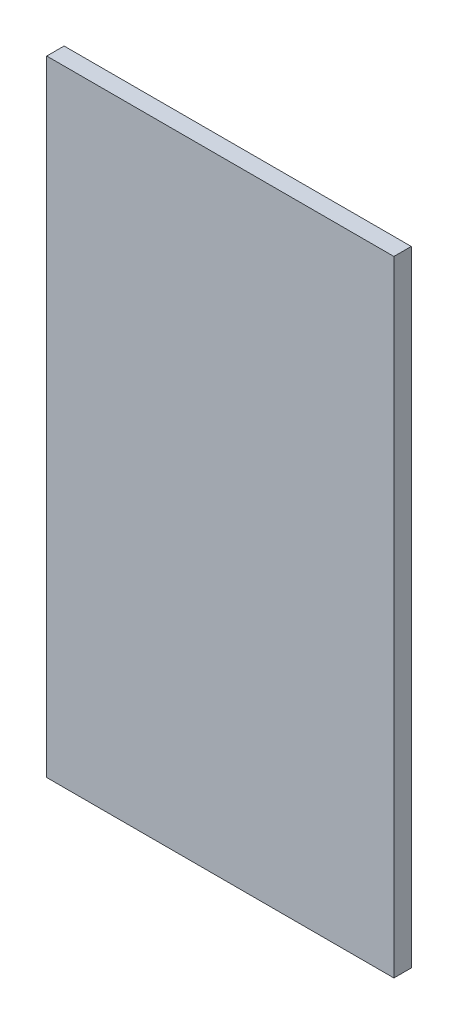
ISO-10303-21;
HEADER;
FILE_DESCRIPTION(('STEP AP214'),'2;1');
FILE_NAME('part.step','',(''),(''),'','','');
FILE_SCHEMA(('AUTOMOTIVE_DESIGN { 1 0 10303 214 1 1 1 1 }'));
ENDSEC;
DATA;
#1=APPLICATION_CONTEXT('core data for automotive mechanical design processes');
#2=APPLICATION_PROTOCOL_DEFINITION('international standard','automotive_design',2000,#1);
#3=PRODUCT_CONTEXT('',#1,'mechanical');
#4=PRODUCT('Part','Part','',(#3));
#5=PRODUCT_RELATED_PRODUCT_CATEGORY('part','',(#4));
#6=PRODUCT_DEFINITION_FORMATION('','',#4);
#7=PRODUCT_DEFINITION_CONTEXT('part definition',#1,'design');
#8=PRODUCT_DEFINITION('design','',#6,#7);
#9=PRODUCT_DEFINITION_SHAPE('','',#8);
#10=(LENGTH_UNIT() NAMED_UNIT(*) SI_UNIT(.MILLI.,.METRE.));
#11=(NAMED_UNIT(*) PLANE_ANGLE_UNIT() SI_UNIT($,.RADIAN.));
#12=(NAMED_UNIT(*) SI_UNIT($,.STERADIAN.) SOLID_ANGLE_UNIT());
#13=UNCERTAINTY_MEASURE_WITH_UNIT(LENGTH_MEASURE(1.E-05),#10,'distance_accuracy_value','');
#14=(GEOMETRIC_REPRESENTATION_CONTEXT(3) GLOBAL_UNCERTAINTY_ASSIGNED_CONTEXT((#13)) GLOBAL_UNIT_ASSIGNED_CONTEXT((#10,
#11,#12)) REPRESENTATION_CONTEXT('',''));
#15=CARTESIAN_POINT('',(0.,0.,0.));
#16=DIRECTION('',(0.,0.,1.));
#17=DIRECTION('',(1.,0.,0.));
#18=AXIS2_PLACEMENT_3D('',#15,#16,#17);
#19=CARTESIAN_POINT('',(50.,-90.,5.));
#20=DIRECTION('',(-1.,0.,0.));
#21=DIRECTION('',(0.,0.,1.));
#22=AXIS2_PLACEMENT_3D('',#19,#20,#21);
#23=PLANE('',#22);
#24=DIRECTION('',(0.,1.,0.));
#25=VECTOR('',#24,1.);
#26=CARTESIAN_POINT('',(50.,-90.,0.));
#27=LINE('',#26,#25);
#28=CARTESIAN_POINT('',(50.,-90.,0.));
#29=VERTEX_POINT('',#28);
#30=CARTESIAN_POINT('',(50.,90.,0.));
#31=VERTEX_POINT('',#30);
#32=EDGE_CURVE('E96',#29,#31,#27,.T.);
#33=ORIENTED_EDGE('',*,*,#32,.T.);
#34=DIRECTION('',(0.,0.,-1.));
#35=VECTOR('',#34,1.);
#36=CARTESIAN_POINT('',(50.,90.,5.));
#37=LINE('',#36,#35);
#38=CARTESIAN_POINT('',(50.,90.,5.));
#39=VERTEX_POINT('',#38);
#40=EDGE_CURVE('E11',#39,#31,#37,.T.);
#41=ORIENTED_EDGE('',*,*,#40,.F.);
#42=DIRECTION('',(0.,1.,0.));
#43=VECTOR('',#42,1.);
#44=CARTESIAN_POINT('',(50.,-90.,5.));
#45=LINE('',#44,#43);
#46=CARTESIAN_POINT('',(50.,-90.,5.));
#47=VERTEX_POINT('',#46);
#48=EDGE_CURVE('E84',#47,#39,#45,.T.);
#49=ORIENTED_EDGE('',*,*,#48,.F.);
#50=DIRECTION('',(0.,0.,-1.));
#51=VECTOR('',#50,1.);
#52=CARTESIAN_POINT('',(50.,-90.,5.));
#53=LINE('',#52,#51);
#54=EDGE_CURVE('E92',#47,#29,#53,.T.);
#55=ORIENTED_EDGE('',*,*,#54,.T.);
#56=EDGE_LOOP('',(#33,#41,#49,#55));
#57=FACE_BOUND('',#56,.T.);
#58=ADVANCED_FACE('F33',(#57),#23,.F.);
#59=CARTESIAN_POINT('',(-50.,90.,5.));
#60=DIRECTION('',(0.,-1.,0.));
#61=DIRECTION('',(0.,0.,-1.));
#62=AXIS2_PLACEMENT_3D('',#59,#60,#61);
#63=PLANE('',#62);
#64=DIRECTION('',(-1.,0.,0.));
#65=VECTOR('',#64,1.);
#66=CARTESIAN_POINT('',(-50.,90.,0.));
#67=LINE('',#66,#65);
#68=CARTESIAN_POINT('',(-50.,90.,0.));
#69=VERTEX_POINT('',#68);
#70=EDGE_CURVE('E88',#31,#69,#67,.T.);
#71=ORIENTED_EDGE('',*,*,#70,.T.);
#72=DIRECTION('',(0.,0.,-1.));
#73=VECTOR('',#72,1.);
#74=CARTESIAN_POINT('',(-50.,90.,5.));
#75=LINE('',#74,#73);
#76=CARTESIAN_POINT('',(-50.,90.,5.));
#77=VERTEX_POINT('',#76);
#78=EDGE_CURVE('E41',#77,#69,#75,.T.);
#79=ORIENTED_EDGE('',*,*,#78,.F.);
#80=DIRECTION('',(-1.,0.,0.));
#81=VECTOR('',#80,1.);
#82=CARTESIAN_POINT('',(-50.,90.,5.));
#83=LINE('',#82,#81);
#84=EDGE_CURVE('E79',#39,#77,#83,.T.);
#85=ORIENTED_EDGE('',*,*,#84,.F.);
#86=ORIENTED_EDGE('',*,*,#40,.T.);
#87=EDGE_LOOP('',(#71,#79,#85,#86));
#88=FACE_BOUND('',#87,.T.);
#89=ADVANCED_FACE('F87',(#88),#63,.F.);
#90=CARTESIAN_POINT('',(-50.,-90.,5.));
#91=DIRECTION('',(1.,0.,0.));
#92=DIRECTION('',(0.,0.,-1.));
#93=AXIS2_PLACEMENT_3D('',#90,#91,#92);
#94=PLANE('',#93);
#95=DIRECTION('',(0.,-1.,0.));
#96=VECTOR('',#95,1.);
#97=CARTESIAN_POINT('',(-50.,-90.,0.));
#98=LINE('',#97,#96);
#99=CARTESIAN_POINT('',(-50.,-90.,0.));
#100=VERTEX_POINT('',#99);
#101=EDGE_CURVE('E66',#69,#100,#98,.T.);
#102=ORIENTED_EDGE('',*,*,#101,.T.);
#103=DIRECTION('',(0.,0.,-1.));
#104=VECTOR('',#103,1.);
#105=CARTESIAN_POINT('',(-50.,-90.,5.));
#106=LINE('',#105,#104);
#107=CARTESIAN_POINT('',(-50.,-90.,5.));
#108=VERTEX_POINT('',#107);
#109=EDGE_CURVE('E89',#108,#100,#106,.T.);
#110=ORIENTED_EDGE('',*,*,#109,.F.);
#111=DIRECTION('',(0.,-1.,0.));
#112=VECTOR('',#111,1.);
#113=CARTESIAN_POINT('',(-50.,-90.,5.));
#114=LINE('',#113,#112);
#115=EDGE_CURVE('E82',#77,#108,#114,.T.);
#116=ORIENTED_EDGE('',*,*,#115,.F.);
#117=ORIENTED_EDGE('',*,*,#78,.T.);
#118=EDGE_LOOP('',(#102,#110,#116,#117));
#119=FACE_BOUND('',#118,.T.);
#120=ADVANCED_FACE('F90',(#119),#94,.F.);
#121=CARTESIAN_POINT('',(-50.,-90.,5.));
#122=DIRECTION('',(0.,1.,0.));
#123=DIRECTION('',(0.,0.,1.));
#124=AXIS2_PLACEMENT_3D('',#121,#122,#123);
#125=PLANE('',#124);
#126=DIRECTION('',(1.,0.,0.));
#127=VECTOR('',#126,1.);
#128=CARTESIAN_POINT('',(-50.,-90.,0.));
#129=LINE('',#128,#127);
#130=EDGE_CURVE('E72',#100,#29,#129,.T.);
#131=ORIENTED_EDGE('',*,*,#130,.T.);
#132=ORIENTED_EDGE('',*,*,#54,.F.);
#133=DIRECTION('',(1.,0.,0.));
#134=VECTOR('',#133,1.);
#135=CARTESIAN_POINT('',(-50.,-90.,5.));
#136=LINE('',#135,#134);
#137=EDGE_CURVE('E49',#108,#47,#136,.T.);
#138=ORIENTED_EDGE('',*,*,#137,.F.);
#139=ORIENTED_EDGE('',*,*,#109,.T.);
#140=EDGE_LOOP('',(#131,#132,#138,#139));
#141=FACE_BOUND('',#140,.T.);
#142=ADVANCED_FACE('F103',(#141),#125,.F.);
#143=CARTESIAN_POINT('',(0.,0.,5.));
#144=DIRECTION('',(0.,0.,-1.));
#145=DIRECTION('',(-1.,0.,0.));
#146=AXIS2_PLACEMENT_3D('',#143,#144,#145);
#147=PLANE('',#146);
#148=ORIENTED_EDGE('',*,*,#48,.T.);
#149=ORIENTED_EDGE('',*,*,#84,.T.);
#150=ORIENTED_EDGE('',*,*,#115,.T.);
#151=ORIENTED_EDGE('',*,*,#137,.T.);
#152=EDGE_LOOP('',(#148,#149,#150,#151));
#153=FACE_BOUND('',#152,.T.);
#154=ADVANCED_FACE('F80',(#153),#147,.F.);
#155=CARTESIAN_POINT('',(0.,0.,0.));
#156=DIRECTION('',(0.,0.,-1.));
#157=DIRECTION('',(-1.,0.,0.));
#158=AXIS2_PLACEMENT_3D('',#155,#156,#157);
#159=PLANE('',#158);
#160=ORIENTED_EDGE('',*,*,#32,.F.);
#161=ORIENTED_EDGE('',*,*,#130,.F.);
#162=ORIENTED_EDGE('',*,*,#101,.F.);
#163=ORIENTED_EDGE('',*,*,#70,.F.);
#164=EDGE_LOOP('',(#160,#161,#162,#163));
#165=FACE_BOUND('',#164,.T.);
#166=ADVANCED_FACE('F106',(#165),#159,.T.);
#167=CLOSED_SHELL('',(#58,#89,#120,#142,#154,#166));
#168=MANIFOLD_SOLID_BREP('B2',#167);
#169=ADVANCED_BREP_SHAPE_REPRESENTATION('',(#18,#168),#14);
#170=SHAPE_DEFINITION_REPRESENTATION(#9,#169);
ENDSEC;
END-ISO-10303-21;
